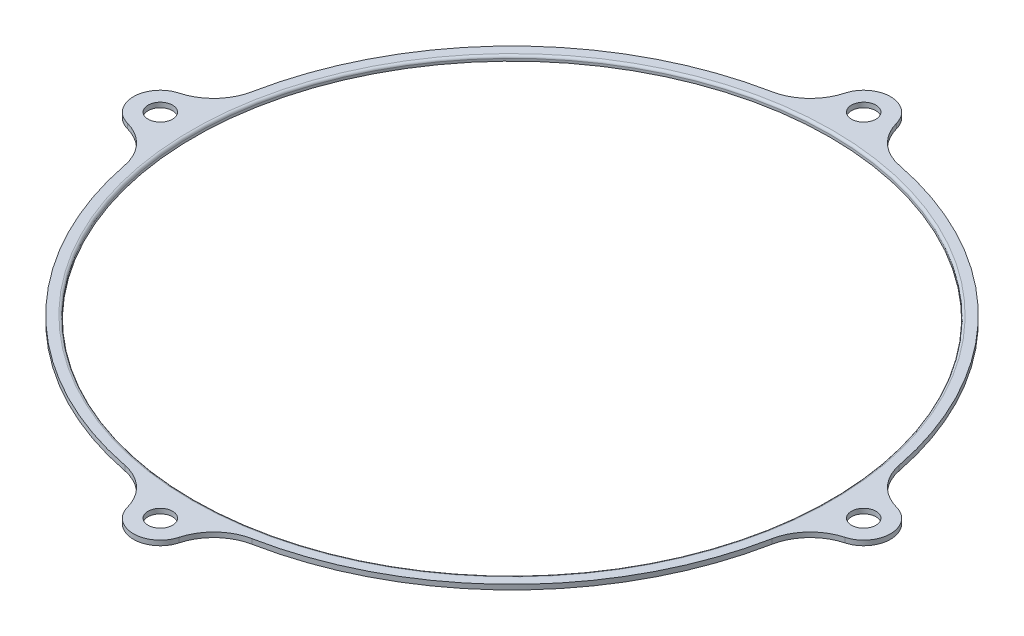
ISO-10303-21;
HEADER;
FILE_DESCRIPTION(('STEP AP214'),'2;1');
FILE_NAME('part.step','',(''),(''),'','','');
FILE_SCHEMA(('AUTOMOTIVE_DESIGN { 1 0 10303 214 1 1 1 1 }'));
ENDSEC;
DATA;
#1=APPLICATION_CONTEXT('core data for automotive mechanical design processes');
#2=APPLICATION_PROTOCOL_DEFINITION('international standard','automotive_design',2000,#1);
#3=PRODUCT_CONTEXT('',#1,'mechanical');
#4=PRODUCT('Part','Part','',(#3));
#5=PRODUCT_RELATED_PRODUCT_CATEGORY('part','',(#4));
#6=PRODUCT_DEFINITION_FORMATION('','',#4);
#7=PRODUCT_DEFINITION_CONTEXT('part definition',#1,'design');
#8=PRODUCT_DEFINITION('design','',#6,#7);
#9=PRODUCT_DEFINITION_SHAPE('','',#8);
#10=(LENGTH_UNIT() NAMED_UNIT(*) SI_UNIT(.MILLI.,.METRE.));
#11=(NAMED_UNIT(*) PLANE_ANGLE_UNIT() SI_UNIT($,.RADIAN.));
#12=(NAMED_UNIT(*) SI_UNIT($,.STERADIAN.) SOLID_ANGLE_UNIT());
#13=UNCERTAINTY_MEASURE_WITH_UNIT(LENGTH_MEASURE(1.E-05),#10,'distance_accuracy_value','');
#14=(GEOMETRIC_REPRESENTATION_CONTEXT(3) GLOBAL_UNCERTAINTY_ASSIGNED_CONTEXT((#13)) GLOBAL_UNIT_ASSIGNED_CONTEXT((#10,
#11,#12)) REPRESENTATION_CONTEXT('',''));
#15=CARTESIAN_POINT('',(0.,0.,0.));
#16=DIRECTION('',(0.,0.,1.));
#17=DIRECTION('',(1.,0.,0.));
#18=AXIS2_PLACEMENT_3D('',#15,#16,#17);
#19=CARTESIAN_POINT('',(0.,3.,0.));
#20=DIRECTION('',(0.,-1.,0.));
#21=DIRECTION('',(0.,0.,-1.));
#22=AXIS2_PLACEMENT_3D('',#19,#20,#21);
#23=CYLINDRICAL_SURFACE('',#22,67.5);
#24=DIRECTION('',(0.,-1.,0.));
#25=VECTOR('',#24,1.);
#26=CARTESIAN_POINT('',(-13.0329760411857,201.116127561589,66.2298387096774));
#27=LINE('',#26,#25);
#28=CARTESIAN_POINT('',(-13.0329760411857,1.,66.2298387096774));
#29=VERTEX_POINT('',#28);
#30=CARTESIAN_POINT('',(-13.0329760411857,0.,66.2298387096774));
#31=VERTEX_POINT('',#30);
#32=EDGE_CURVE('E274',#29,#31,#27,.T.);
#33=ORIENTED_EDGE('',*,*,#32,.F.);
#34=CARTESIAN_POINT('',(0.,1.,0.));
#35=DIRECTION('',(0.,-1.,0.));
#36=DIRECTION('',(0.,0.,-1.));
#37=AXIS2_PLACEMENT_3D('',#34,#35,#36);
#38=CIRCLE('',#37,67.5);
#39=CARTESIAN_POINT('',(-66.2298387096774,1.,13.0329760411855));
#40=VERTEX_POINT('',#39);
#41=EDGE_CURVE('E314',#29,#40,#38,.T.);
#42=ORIENTED_EDGE('',*,*,#41,.T.);
#43=DIRECTION('',(0.,-1.,0.));
#44=VECTOR('',#43,1.);
#45=CARTESIAN_POINT('',(-66.2298387096774,201.116127561589,13.0329760411855));
#46=LINE('',#45,#44);
#47=CARTESIAN_POINT('',(-66.2298387096774,0.,13.0329760411855));
#48=VERTEX_POINT('',#47);
#49=EDGE_CURVE('E272',#40,#48,#46,.T.);
#50=ORIENTED_EDGE('',*,*,#49,.T.);
#51=CARTESIAN_POINT('',(0.,0.,0.));
#52=DIRECTION('',(0.,1.,0.));
#53=DIRECTION('',(0.,0.,1.));
#54=AXIS2_PLACEMENT_3D('',#51,#52,#53);
#55=CIRCLE('',#54,67.5);
#56=EDGE_CURVE('E218',#48,#31,#55,.T.);
#57=ORIENTED_EDGE('',*,*,#56,.T.);
#58=EDGE_LOOP('',(#33,#42,#50,#57));
#59=FACE_BOUND('',#58,.T.);
#60=ADVANCED_FACE('F43',(#59),#23,.T.);
#61=DIRECTION('',(0.,-1.,0.));
#62=VECTOR('',#61,1.);
#63=CARTESIAN_POINT('',(13.0329760411862,201.116127561589,-66.2298387096773));
#64=LINE('',#63,#62);
#65=CARTESIAN_POINT('',(13.0329760411862,1.,-66.2298387096773));
#66=VERTEX_POINT('',#65);
#67=CARTESIAN_POINT('',(13.0329760411862,0.,-66.2298387096773));
#68=VERTEX_POINT('',#67);
#69=EDGE_CURVE('E174',#66,#68,#64,.T.);
#70=ORIENTED_EDGE('',*,*,#69,.F.);
#71=CARTESIAN_POINT('',(0.,1.,0.));
#72=DIRECTION('',(0.,-1.,0.));
#73=DIRECTION('',(0.,0.,-1.));
#74=AXIS2_PLACEMENT_3D('',#71,#72,#73);
#75=CIRCLE('',#74,67.5);
#76=CARTESIAN_POINT('',(66.2298387096774,1.,-13.0329760411855));
#77=VERTEX_POINT('',#76);
#78=EDGE_CURVE('E160',#66,#77,#75,.T.);
#79=ORIENTED_EDGE('',*,*,#78,.T.);
#80=DIRECTION('',(0.,-1.,0.));
#81=VECTOR('',#80,1.);
#82=CARTESIAN_POINT('',(66.2298387096774,201.116127561589,-13.0329760411855));
#83=LINE('',#82,#81);
#84=CARTESIAN_POINT('',(66.2298387096774,0.,-13.0329760411855));
#85=VERTEX_POINT('',#84);
#86=EDGE_CURVE('E172',#77,#85,#83,.T.);
#87=ORIENTED_EDGE('',*,*,#86,.T.);
#88=CARTESIAN_POINT('',(0.,0.,0.));
#89=DIRECTION('',(0.,1.,0.));
#90=DIRECTION('',(0.,0.,1.));
#91=AXIS2_PLACEMENT_3D('',#88,#89,#90);
#92=CIRCLE('',#91,67.5);
#93=EDGE_CURVE('E243',#85,#68,#92,.T.);
#94=ORIENTED_EDGE('',*,*,#93,.T.);
#95=EDGE_LOOP('',(#70,#79,#87,#94));
#96=FACE_BOUND('',#95,.T.);
#97=ADVANCED_FACE('F170',(#96),#23,.T.);
#98=DIRECTION('',(0.,-1.,0.));
#99=VECTOR('',#98,1.);
#100=CARTESIAN_POINT('',(-66.2298387096774,201.116127561589,-13.0329760411855));
#101=LINE('',#100,#99);
#102=CARTESIAN_POINT('',(-66.2298387096774,1.,-13.0329760411854));
#103=VERTEX_POINT('',#102);
#104=CARTESIAN_POINT('',(-66.2298387096774,0.,-13.0329760411855));
#105=VERTEX_POINT('',#104);
#106=EDGE_CURVE('E266',#103,#105,#101,.T.);
#107=ORIENTED_EDGE('',*,*,#106,.F.);
#108=CARTESIAN_POINT('',(0.,1.,0.));
#109=DIRECTION('',(0.,-1.,0.));
#110=DIRECTION('',(0.,0.,-1.));
#111=AXIS2_PLACEMENT_3D('',#108,#109,#110);
#112=CIRCLE('',#111,67.5);
#113=CARTESIAN_POINT('',(-13.0329760411848,1.,-66.2298387096776));
#114=VERTEX_POINT('',#113);
#115=EDGE_CURVE('E338',#103,#114,#112,.T.);
#116=ORIENTED_EDGE('',*,*,#115,.T.);
#117=DIRECTION('',(0.,-1.,0.));
#118=VECTOR('',#117,1.);
#119=CARTESIAN_POINT('',(-13.0329760411848,201.116127561589,-66.2298387096776));
#120=LINE('',#119,#118);
#121=CARTESIAN_POINT('',(-13.0329760411848,0.,-66.2298387096776));
#122=VERTEX_POINT('',#121);
#123=EDGE_CURVE('E264',#114,#122,#120,.T.);
#124=ORIENTED_EDGE('',*,*,#123,.T.);
#125=CARTESIAN_POINT('',(0.,0.,0.));
#126=DIRECTION('',(0.,1.,0.));
#127=DIRECTION('',(0.,0.,1.));
#128=AXIS2_PLACEMENT_3D('',#125,#126,#127);
#129=CIRCLE('',#128,67.5);
#130=EDGE_CURVE('E236',#122,#105,#129,.T.);
#131=ORIENTED_EDGE('',*,*,#130,.T.);
#132=EDGE_LOOP('',(#107,#116,#124,#131));
#133=FACE_BOUND('',#132,.T.);
#134=ADVANCED_FACE('F337',(#133),#23,.T.);
#135=DIRECTION('',(0.,-1.,0.));
#136=VECTOR('',#135,1.);
#137=CARTESIAN_POINT('',(66.2298387096774,201.116127561589,13.0329760411855));
#138=LINE('',#137,#136);
#139=CARTESIAN_POINT('',(66.2298387096774,1.,13.0329760411855));
#140=VERTEX_POINT('',#139);
#141=CARTESIAN_POINT('',(66.2298387096774,0.,13.0329760411855));
#142=VERTEX_POINT('',#141);
#143=EDGE_CURVE('E187',#140,#142,#138,.T.);
#144=ORIENTED_EDGE('',*,*,#143,.F.);
#145=CARTESIAN_POINT('',(0.,1.,0.));
#146=DIRECTION('',(0.,-1.,0.));
#147=DIRECTION('',(0.,0.,-1.));
#148=AXIS2_PLACEMENT_3D('',#145,#146,#147);
#149=CIRCLE('',#148,67.5);
#150=CARTESIAN_POINT('',(13.0329760411852,1.,66.2298387096775));
#151=VERTEX_POINT('',#150);
#152=EDGE_CURVE('E295',#140,#151,#149,.T.);
#153=ORIENTED_EDGE('',*,*,#152,.T.);
#154=DIRECTION('',(0.,-1.,0.));
#155=VECTOR('',#154,1.);
#156=CARTESIAN_POINT('',(13.0329760411852,201.116127561589,66.2298387096775));
#157=LINE('',#156,#155);
#158=CARTESIAN_POINT('',(13.0329760411852,0.,66.2298387096775));
#159=VERTEX_POINT('',#158);
#160=EDGE_CURVE('E66',#151,#159,#157,.T.);
#161=ORIENTED_EDGE('',*,*,#160,.T.);
#162=CARTESIAN_POINT('',(0.,0.,0.));
#163=DIRECTION('',(0.,1.,0.));
#164=DIRECTION('',(0.,0.,1.));
#165=AXIS2_PLACEMENT_3D('',#162,#163,#164);
#166=CIRCLE('',#165,67.5);
#167=EDGE_CURVE('E216',#159,#142,#166,.T.);
#168=ORIENTED_EDGE('',*,*,#167,.T.);
#169=EDGE_LOOP('',(#144,#153,#161,#168));
#170=FACE_BOUND('',#169,.T.);
#171=ADVANCED_FACE('F294',(#170),#23,.T.);
#172=CARTESIAN_POINT('',(76.0416666666667,201.116127561589,14.9637873065463));
#173=DIRECTION('',(0.,-1.,0.));
#174=DIRECTION('',(0.,0.,-1.));
#175=AXIS2_PLACEMENT_3D('',#172,#173,#174);
#176=CYLINDRICAL_SURFACE('',#175,10.);
#177=CARTESIAN_POINT('',(76.0416666666667,1.,14.9637873065463));
#178=DIRECTION('',(0.,1.,0.));
#179=DIRECTION('',(0.,0.,-1.));
#180=AXIS2_PLACEMENT_3D('',#177,#178,#179);
#181=CIRCLE('',#180,9.99999999999999);
#182=CARTESIAN_POINT('',(73.4341397849462,1.,5.30973097974224));
#183=VERTEX_POINT('',#182);
#184=EDGE_CURVE('E293',#183,#140,#181,.T.);
#185=ORIENTED_EDGE('',*,*,#184,.T.);
#186=ORIENTED_EDGE('',*,*,#143,.T.);
#187=CARTESIAN_POINT('',(76.0416666666667,0.,14.9637873065463));
#188=DIRECTION('',(0.,1.,0.));
#189=DIRECTION('',(0.,0.,1.));
#190=AXIS2_PLACEMENT_3D('',#187,#188,#189);
#191=CIRCLE('',#190,10.);
#192=CARTESIAN_POINT('',(73.4341397849462,0.,5.30973097974223));
#193=VERTEX_POINT('',#192);
#194=EDGE_CURVE('E227',#193,#142,#191,.T.);
#195=ORIENTED_EDGE('',*,*,#194,.F.);
#196=DIRECTION('',(0.,-1.,0.));
#197=VECTOR('',#196,1.);
#198=CARTESIAN_POINT('',(73.4341397849462,201.116127561589,5.30973097974223));
#199=LINE('',#198,#197);
#200=EDGE_CURVE('E183',#183,#193,#199,.T.);
#201=ORIENTED_EDGE('',*,*,#200,.F.);
#202=EDGE_LOOP('',(#185,#186,#195,#201));
#203=FACE_BOUND('',#202,.T.);
#204=ADVANCED_FACE('F291',(#203),#176,.F.);
#205=CARTESIAN_POINT('',(72.,201.116127561589,0.));
#206=DIRECTION('',(0.,-1.,0.));
#207=DIRECTION('',(0.,0.,-1.));
#208=AXIS2_PLACEMENT_3D('',#205,#206,#207);
#209=CYLINDRICAL_SURFACE('',#208,5.5);
#210=CARTESIAN_POINT('',(72.,1.,0.));
#211=DIRECTION('',(0.,-1.,0.));
#212=DIRECTION('',(0.,0.,-1.));
#213=AXIS2_PLACEMENT_3D('',#210,#211,#212);
#214=CIRCLE('',#213,5.5);
#215=CARTESIAN_POINT('',(73.4341397849462,1.,-5.30973097974223));
#216=VERTEX_POINT('',#215);
#217=EDGE_CURVE('E163',#216,#183,#214,.T.);
#218=ORIENTED_EDGE('',*,*,#217,.T.);
#219=ORIENTED_EDGE('',*,*,#200,.T.);
#220=CARTESIAN_POINT('',(72.,0.,0.));
#221=DIRECTION('',(0.,1.,0.));
#222=DIRECTION('',(0.,0.,1.));
#223=AXIS2_PLACEMENT_3D('',#220,#221,#222);
#224=CIRCLE('',#223,5.5);
#225=CARTESIAN_POINT('',(73.4341397849462,0.,-5.30973097974223));
#226=VERTEX_POINT('',#225);
#227=EDGE_CURVE('E233',#226,#193,#224,.F.);
#228=ORIENTED_EDGE('',*,*,#227,.F.);
#229=DIRECTION('',(0.,-1.,0.));
#230=VECTOR('',#229,1.);
#231=CARTESIAN_POINT('',(73.4341397849462,201.116127561589,-5.30973097974223));
#232=LINE('',#231,#230);
#233=EDGE_CURVE('E180',#216,#226,#232,.T.);
#234=ORIENTED_EDGE('',*,*,#233,.F.);
#235=EDGE_LOOP('',(#218,#219,#228,#234));
#236=FACE_BOUND('',#235,.T.);
#237=ADVANCED_FACE('F284',(#236),#209,.T.);
#238=CARTESIAN_POINT('',(76.0416666666667,201.116127561589,-14.9637873065463));
#239=DIRECTION('',(0.,-1.,0.));
#240=DIRECTION('',(0.,0.,-1.));
#241=AXIS2_PLACEMENT_3D('',#238,#239,#240);
#242=CYLINDRICAL_SURFACE('',#241,10.);
#243=CARTESIAN_POINT('',(76.0416666666667,1.,-14.9637873065463));
#244=DIRECTION('',(0.,1.,0.));
#245=DIRECTION('',(0.,0.,-1.));
#246=AXIS2_PLACEMENT_3D('',#243,#244,#245);
#247=CIRCLE('',#246,10.);
#248=EDGE_CURVE('E156',#77,#216,#247,.T.);
#249=ORIENTED_EDGE('',*,*,#248,.T.);
#250=ORIENTED_EDGE('',*,*,#233,.T.);
#251=CARTESIAN_POINT('',(76.0416666666667,0.,-14.9637873065463));
#252=DIRECTION('',(0.,1.,0.));
#253=DIRECTION('',(0.,0.,1.));
#254=AXIS2_PLACEMENT_3D('',#251,#252,#253);
#255=CIRCLE('',#254,10.);
#256=EDGE_CURVE('E179',#85,#226,#255,.T.);
#257=ORIENTED_EDGE('',*,*,#256,.F.);
#258=ORIENTED_EDGE('',*,*,#86,.F.);
#259=EDGE_LOOP('',(#249,#250,#257,#258));
#260=FACE_BOUND('',#259,.T.);
#261=ADVANCED_FACE('F177',(#260),#242,.F.);
#262=CARTESIAN_POINT('',(72.,201.116127561589,0.));
#263=DIRECTION('',(0.,-1.,0.));
#264=DIRECTION('',(0.,0.,-1.));
#265=AXIS2_PLACEMENT_3D('',#262,#263,#264);
#266=CYLINDRICAL_SURFACE('',#265,2.49999999999999);
#267=CARTESIAN_POINT('',(72.,1.,0.));
#268=DIRECTION('',(0.,-1.,0.));
#269=DIRECTION('',(0.,0.,-1.));
#270=AXIS2_PLACEMENT_3D('',#267,#268,#269);
#271=CIRCLE('',#270,2.49999999999999);
#272=CARTESIAN_POINT('',(72.,1.,-2.49999999999999));
#273=VERTEX_POINT('',#272);
#274=EDGE_CURVE('E195',#273,#273,#271,.F.);
#275=ORIENTED_EDGE('',*,*,#274,.T.);
#276=EDGE_LOOP('',(#275));
#277=FACE_BOUND('',#276,.T.);
#278=CARTESIAN_POINT('',(72.,0.,0.));
#279=DIRECTION('',(0.,1.,0.));
#280=DIRECTION('',(0.,0.,1.));
#281=AXIS2_PLACEMENT_3D('',#278,#279,#280);
#282=CIRCLE('',#281,2.49999999999999);
#283=CARTESIAN_POINT('',(72.,0.,2.49999999999999));
#284=VERTEX_POINT('',#283);
#285=EDGE_CURVE('E257',#284,#284,#282,.F.);
#286=ORIENTED_EDGE('',*,*,#285,.T.);
#287=EDGE_LOOP('',(#286));
#288=FACE_BOUND('',#287,.T.);
#289=ADVANCED_FACE('F416',(#277,#288),#266,.F.);
#290=CARTESIAN_POINT('',(-72.,201.116127561589,0.));
#291=DIRECTION('',(0.,-1.,0.));
#292=DIRECTION('',(0.,0.,-1.));
#293=AXIS2_PLACEMENT_3D('',#290,#291,#292);
#294=CYLINDRICAL_SURFACE('',#293,2.49999999999999);
#295=CARTESIAN_POINT('',(-72.,1.,0.));
#296=DIRECTION('',(0.,-1.,0.));
#297=DIRECTION('',(0.,0.,-1.));
#298=AXIS2_PLACEMENT_3D('',#295,#296,#297);
#299=CIRCLE('',#298,2.49999999999999);
#300=CARTESIAN_POINT('',(-72.,1.,-2.49999999999999));
#301=VERTEX_POINT('',#300);
#302=EDGE_CURVE('E199',#301,#301,#299,.F.);
#303=ORIENTED_EDGE('',*,*,#302,.T.);
#304=EDGE_LOOP('',(#303));
#305=FACE_BOUND('',#304,.T.);
#306=CARTESIAN_POINT('',(-72.,0.,0.));
#307=DIRECTION('',(0.,1.,0.));
#308=DIRECTION('',(0.,0.,1.));
#309=AXIS2_PLACEMENT_3D('',#306,#307,#308);
#310=CIRCLE('',#309,2.49999999999999);
#311=CARTESIAN_POINT('',(-72.,0.,2.49999999999999));
#312=VERTEX_POINT('',#311);
#313=EDGE_CURVE('E254',#312,#312,#310,.F.);
#314=ORIENTED_EDGE('',*,*,#313,.T.);
#315=EDGE_LOOP('',(#314));
#316=FACE_BOUND('',#315,.T.);
#317=ADVANCED_FACE('F410',(#305,#316),#294,.F.);
#318=CARTESIAN_POINT('',(-72.,201.116127561589,0.));
#319=DIRECTION('',(0.,-1.,0.));
#320=DIRECTION('',(0.,0.,-1.));
#321=AXIS2_PLACEMENT_3D('',#318,#319,#320);
#322=CYLINDRICAL_SURFACE('',#321,5.5);
#323=CARTESIAN_POINT('',(-72.,1.,0.));
#324=DIRECTION('',(0.,-1.,0.));
#325=DIRECTION('',(0.,0.,-1.));
#326=AXIS2_PLACEMENT_3D('',#323,#324,#325);
#327=CIRCLE('',#326,5.5);
#328=CARTESIAN_POINT('',(-73.4341397849462,1.,5.30973097974223));
#329=VERTEX_POINT('',#328);
#330=CARTESIAN_POINT('',(-73.4341397849462,1.,-5.30973097974223));
#331=VERTEX_POINT('',#330);
#332=EDGE_CURVE('E326',#329,#331,#327,.T.);
#333=ORIENTED_EDGE('',*,*,#332,.T.);
#334=DIRECTION('',(0.,-1.,0.));
#335=VECTOR('',#334,1.);
#336=CARTESIAN_POINT('',(-73.4341397849462,201.116127561589,-5.30973097974223));
#337=LINE('',#336,#335);
#338=CARTESIAN_POINT('',(-73.4341397849462,0.,-5.30973097974223));
#339=VERTEX_POINT('',#338);
#340=EDGE_CURVE('E268',#331,#339,#337,.T.);
#341=ORIENTED_EDGE('',*,*,#340,.T.);
#342=CARTESIAN_POINT('',(-72.,0.,0.));
#343=DIRECTION('',(0.,1.,0.));
#344=DIRECTION('',(0.,0.,1.));
#345=AXIS2_PLACEMENT_3D('',#342,#343,#344);
#346=CIRCLE('',#345,5.5);
#347=CARTESIAN_POINT('',(-73.4341397849462,0.,5.30973097974223));
#348=VERTEX_POINT('',#347);
#349=EDGE_CURVE('E224',#348,#339,#346,.F.);
#350=ORIENTED_EDGE('',*,*,#349,.F.);
#351=DIRECTION('',(0.,-1.,0.));
#352=VECTOR('',#351,1.);
#353=CARTESIAN_POINT('',(-73.4341397849462,201.116127561589,5.30973097974223));
#354=LINE('',#353,#352);
#355=EDGE_CURVE('E270',#329,#348,#354,.T.);
#356=ORIENTED_EDGE('',*,*,#355,.F.);
#357=EDGE_LOOP('',(#333,#341,#350,#356));
#358=FACE_BOUND('',#357,.T.);
#359=ADVANCED_FACE('F325',(#358),#322,.T.);
#360=CARTESIAN_POINT('',(-76.0416666666667,201.116127561589,14.9637873065463));
#361=DIRECTION('',(0.,-1.,0.));
#362=DIRECTION('',(0.,0.,-1.));
#363=AXIS2_PLACEMENT_3D('',#360,#361,#362);
#364=CYLINDRICAL_SURFACE('',#363,10.);
#365=CARTESIAN_POINT('',(-76.0416666666667,1.,14.9637873065463));
#366=DIRECTION('',(0.,1.,0.));
#367=DIRECTION('',(0.,0.,-1.));
#368=AXIS2_PLACEMENT_3D('',#365,#366,#367);
#369=CIRCLE('',#368,9.99999999999999);
#370=EDGE_CURVE('E322',#40,#329,#369,.T.);
#371=ORIENTED_EDGE('',*,*,#370,.T.);
#372=ORIENTED_EDGE('',*,*,#355,.T.);
#373=CARTESIAN_POINT('',(-76.0416666666667,0.,14.9637873065463));
#374=DIRECTION('',(0.,1.,0.));
#375=DIRECTION('',(0.,0.,1.));
#376=AXIS2_PLACEMENT_3D('',#373,#374,#375);
#377=CIRCLE('',#376,10.);
#378=EDGE_CURVE('E221',#48,#348,#377,.T.);
#379=ORIENTED_EDGE('',*,*,#378,.F.);
#380=ORIENTED_EDGE('',*,*,#49,.F.);
#381=EDGE_LOOP('',(#371,#372,#379,#380));
#382=FACE_BOUND('',#381,.T.);
#383=ADVANCED_FACE('F320',(#382),#364,.F.);
#384=CARTESIAN_POINT('',(-76.0416666666667,201.116127561589,-14.9637873065463));
#385=DIRECTION('',(0.,-1.,0.));
#386=DIRECTION('',(0.,0.,-1.));
#387=AXIS2_PLACEMENT_3D('',#384,#385,#386);
#388=CYLINDRICAL_SURFACE('',#387,10.);
#389=CARTESIAN_POINT('',(-76.0416666666667,1.,-14.9637873065463));
#390=DIRECTION('',(0.,1.,0.));
#391=DIRECTION('',(0.,0.,-1.));
#392=AXIS2_PLACEMENT_3D('',#389,#390,#391);
#393=CIRCLE('',#392,9.99999999999999);
#394=EDGE_CURVE('E334',#331,#103,#393,.T.);
#395=ORIENTED_EDGE('',*,*,#394,.T.);
#396=ORIENTED_EDGE('',*,*,#106,.T.);
#397=CARTESIAN_POINT('',(-76.0416666666667,0.,-14.9637873065463));
#398=DIRECTION('',(0.,1.,0.));
#399=DIRECTION('',(0.,0.,1.));
#400=AXIS2_PLACEMENT_3D('',#397,#398,#399);
#401=CIRCLE('',#400,10.);
#402=EDGE_CURVE('E230',#339,#105,#401,.T.);
#403=ORIENTED_EDGE('',*,*,#402,.F.);
#404=ORIENTED_EDGE('',*,*,#340,.F.);
#405=EDGE_LOOP('',(#395,#396,#403,#404));
#406=FACE_BOUND('',#405,.T.);
#407=ADVANCED_FACE('F332',(#406),#388,.F.);
#408=CARTESIAN_POINT('',(-14.9637873065455,201.116127561589,-76.0416666666668));
#409=DIRECTION('',(0.,-1.,0.));
#410=DIRECTION('',(0.,0.,-1.));
#411=AXIS2_PLACEMENT_3D('',#408,#409,#410);
#412=CYLINDRICAL_SURFACE('',#411,10.);
#413=CARTESIAN_POINT('',(-14.9637873065455,1.,-76.0416666666668));
#414=DIRECTION('',(0.,1.,0.));
#415=DIRECTION('',(0.,0.,-1.));
#416=AXIS2_PLACEMENT_3D('',#413,#414,#415);
#417=CIRCLE('',#416,10.);
#418=CARTESIAN_POINT('',(-5.30973097974146,1.,-73.4341397849463));
#419=VERTEX_POINT('',#418);
#420=EDGE_CURVE('E346',#114,#419,#417,.T.);
#421=ORIENTED_EDGE('',*,*,#420,.T.);
#422=DIRECTION('',(0.,-1.,0.));
#423=VECTOR('',#422,1.);
#424=CARTESIAN_POINT('',(-5.30973097974146,201.116127561589,-73.4341397849463));
#425=LINE('',#424,#423);
#426=CARTESIAN_POINT('',(-5.30973097974146,0.,-73.4341397849463));
#427=VERTEX_POINT('',#426);
#428=EDGE_CURVE('E262',#419,#427,#425,.T.);
#429=ORIENTED_EDGE('',*,*,#428,.T.);
#430=CARTESIAN_POINT('',(-14.9637873065455,0.,-76.0416666666668));
#431=DIRECTION('',(0.,1.,0.));
#432=DIRECTION('',(0.,0.,1.));
#433=AXIS2_PLACEMENT_3D('',#430,#431,#432);
#434=CIRCLE('',#433,10.);
#435=EDGE_CURVE('E239',#122,#427,#434,.T.);
#436=ORIENTED_EDGE('',*,*,#435,.F.);
#437=ORIENTED_EDGE('',*,*,#123,.F.);
#438=EDGE_LOOP('',(#421,#429,#436,#437));
#439=FACE_BOUND('',#438,.T.);
#440=ADVANCED_FACE('F344',(#439),#412,.F.);
#441=CARTESIAN_POINT('',(14.9637873065471,201.116127561589,-76.0416666666665));
#442=DIRECTION('',(0.,-1.,0.));
#443=DIRECTION('',(0.,0.,-1.));
#444=AXIS2_PLACEMENT_3D('',#441,#442,#443);
#445=CYLINDRICAL_SURFACE('',#444,10.);
#446=CARTESIAN_POINT('',(14.9637873065471,1.,-76.0416666666665));
#447=DIRECTION('',(0.,1.,0.));
#448=DIRECTION('',(0.,0.,-1.));
#449=AXIS2_PLACEMENT_3D('',#446,#447,#448);
#450=CIRCLE('',#449,10.);
#451=CARTESIAN_POINT('',(5.309730979743,1.,-73.4341397849462));
#452=VERTEX_POINT('',#451);
#453=EDGE_CURVE('E355',#452,#66,#450,.T.);
#454=ORIENTED_EDGE('',*,*,#453,.T.);
#455=ORIENTED_EDGE('',*,*,#69,.T.);
#456=CARTESIAN_POINT('',(14.9637873065471,0.,-76.0416666666665));
#457=DIRECTION('',(0.,1.,0.));
#458=DIRECTION('',(0.,0.,1.));
#459=AXIS2_PLACEMENT_3D('',#456,#457,#458);
#460=CIRCLE('',#459,10.);
#461=CARTESIAN_POINT('',(5.309730979743,0.,-73.4341397849462));
#462=VERTEX_POINT('',#461);
#463=EDGE_CURVE('E248',#462,#68,#460,.T.);
#464=ORIENTED_EDGE('',*,*,#463,.F.);
#465=DIRECTION('',(0.,-1.,0.));
#466=VECTOR('',#465,1.);
#467=CARTESIAN_POINT('',(5.309730979743,201.116127561589,-73.4341397849462));
#468=LINE('',#467,#466);
#469=EDGE_CURVE('E260',#452,#462,#468,.T.);
#470=ORIENTED_EDGE('',*,*,#469,.F.);
#471=EDGE_LOOP('',(#454,#455,#464,#470));
#472=FACE_BOUND('',#471,.T.);
#473=ADVANCED_FACE('F354',(#472),#445,.F.);
#474=CARTESIAN_POINT('',(7.54159969190117E-13,201.116127561589,-72.));
#475=DIRECTION('',(0.,-1.,0.));
#476=DIRECTION('',(0.,0.,-1.));
#477=AXIS2_PLACEMENT_3D('',#474,#475,#476);
#478=CYLINDRICAL_SURFACE('',#477,5.5);
#479=CARTESIAN_POINT('',(7.54159969190117E-13,1.,-72.));
#480=DIRECTION('',(0.,-1.,0.));
#481=DIRECTION('',(0.,0.,-1.));
#482=AXIS2_PLACEMENT_3D('',#479,#480,#481);
#483=CIRCLE('',#482,5.5);
#484=EDGE_CURVE('E350',#419,#452,#483,.T.);
#485=ORIENTED_EDGE('',*,*,#484,.T.);
#486=ORIENTED_EDGE('',*,*,#469,.T.);
#487=CARTESIAN_POINT('',(7.54159969190117E-13,0.,-72.));
#488=DIRECTION('',(0.,1.,0.));
#489=DIRECTION('',(0.,0.,1.));
#490=AXIS2_PLACEMENT_3D('',#487,#488,#489);
#491=CIRCLE('',#490,5.5);
#492=EDGE_CURVE('E245',#427,#462,#491,.F.);
#493=ORIENTED_EDGE('',*,*,#492,.F.);
#494=ORIENTED_EDGE('',*,*,#428,.F.);
#495=EDGE_LOOP('',(#485,#486,#493,#494));
#496=FACE_BOUND('',#495,.T.);
#497=ADVANCED_FACE('F349',(#496),#478,.T.);
#498=CARTESIAN_POINT('',(7.54159969190117E-13,201.116127561589,-72.));
#499=DIRECTION('',(0.,-1.,0.));
#500=DIRECTION('',(0.,0.,-1.));
#501=AXIS2_PLACEMENT_3D('',#498,#499,#500);
#502=CYLINDRICAL_SURFACE('',#501,2.49999999999999);
#503=CARTESIAN_POINT('',(7.54159969190117E-13,1.,-72.));
#504=DIRECTION('',(0.,-1.,0.));
#505=DIRECTION('',(0.,0.,-1.));
#506=AXIS2_PLACEMENT_3D('',#503,#504,#505);
#507=CIRCLE('',#506,2.49999999999999);
#508=CARTESIAN_POINT('',(7.54159969190117E-13,1.,-74.5));
#509=VERTEX_POINT('',#508);
#510=EDGE_CURVE('E204',#509,#509,#507,.F.);
#511=ORIENTED_EDGE('',*,*,#510,.T.);
#512=EDGE_LOOP('',(#511));
#513=FACE_BOUND('',#512,.T.);
#514=CARTESIAN_POINT('',(7.54159969190117E-13,0.,-72.));
#515=DIRECTION('',(0.,1.,0.));
#516=DIRECTION('',(0.,0.,1.));
#517=AXIS2_PLACEMENT_3D('',#514,#515,#516);
#518=CIRCLE('',#517,2.49999999999999);
#519=CARTESIAN_POINT('',(7.54159969190117E-13,0.,-69.5));
#520=VERTEX_POINT('',#519);
#521=EDGE_CURVE('E251',#520,#520,#518,.F.);
#522=ORIENTED_EDGE('',*,*,#521,.T.);
#523=EDGE_LOOP('',(#522));
#524=FACE_BOUND('',#523,.T.);
#525=ADVANCED_FACE('F365',(#513,#524),#502,.F.);
#526=CARTESIAN_POINT('',(-14.9637873065465,201.116127561589,76.0416666666666));
#527=DIRECTION('',(0.,-1.,0.));
#528=DIRECTION('',(0.,0.,-1.));
#529=AXIS2_PLACEMENT_3D('',#526,#527,#528);
#530=CYLINDRICAL_SURFACE('',#529,10.);
#531=CARTESIAN_POINT('',(-14.9637873065465,1.,76.0416666666666));
#532=DIRECTION('',(0.,1.,0.));
#533=DIRECTION('',(0.,0.,-1.));
#534=AXIS2_PLACEMENT_3D('',#531,#532,#533);
#535=CIRCLE('',#534,9.99999999999999);
#536=CARTESIAN_POINT('',(-5.30973097974249,1.,73.4341397849462));
#537=VERTEX_POINT('',#536);
#538=EDGE_CURVE('E311',#537,#29,#535,.T.);
#539=ORIENTED_EDGE('',*,*,#538,.T.);
#540=ORIENTED_EDGE('',*,*,#32,.T.);
#541=CARTESIAN_POINT('',(-14.9637873065465,0.,76.0416666666666));
#542=DIRECTION('',(0.,1.,0.));
#543=DIRECTION('',(0.,0.,1.));
#544=AXIS2_PLACEMENT_3D('',#541,#542,#543);
#545=CIRCLE('',#544,10.);
#546=CARTESIAN_POINT('',(-5.30973097974248,0.,73.4341397849462));
#547=VERTEX_POINT('',#546);
#548=EDGE_CURVE('E213',#547,#31,#545,.T.);
#549=ORIENTED_EDGE('',*,*,#548,.F.);
#550=DIRECTION('',(0.,-1.,0.));
#551=VECTOR('',#550,1.);
#552=CARTESIAN_POINT('',(-5.30973097974248,201.116127561589,73.4341397849462));
#553=LINE('',#552,#551);
#554=EDGE_CURVE('E276',#537,#547,#553,.T.);
#555=ORIENTED_EDGE('',*,*,#554,.F.);
#556=EDGE_LOOP('',(#539,#540,#549,#555));
#557=FACE_BOUND('',#556,.T.);
#558=ADVANCED_FACE('F309',(#557),#530,.F.);
#559=CARTESIAN_POINT('',(-2.51386656396706E-13,201.116127561589,72.));
#560=DIRECTION('',(0.,-1.,0.));
#561=DIRECTION('',(0.,0.,-1.));
#562=AXIS2_PLACEMENT_3D('',#559,#560,#561);
#563=CYLINDRICAL_SURFACE('',#562,5.5);
#564=CARTESIAN_POINT('',(-2.51386656396706E-13,1.,72.));
#565=DIRECTION('',(0.,-1.,0.));
#566=DIRECTION('',(0.,0.,-1.));
#567=AXIS2_PLACEMENT_3D('',#564,#565,#566);
#568=CIRCLE('',#567,5.5);
#569=CARTESIAN_POINT('',(5.30973097974197,1.,73.4341397849462));
#570=VERTEX_POINT('',#569);
#571=EDGE_CURVE('E58',#570,#537,#568,.T.);
#572=ORIENTED_EDGE('',*,*,#571,.T.);
#573=ORIENTED_EDGE('',*,*,#554,.T.);
#574=CARTESIAN_POINT('',(-2.51386656396706E-13,0.,72.));
#575=DIRECTION('',(0.,1.,0.));
#576=DIRECTION('',(0.,0.,1.));
#577=AXIS2_PLACEMENT_3D('',#574,#575,#576);
#578=CIRCLE('',#577,5.5);
#579=CARTESIAN_POINT('',(5.30973097974197,0.,73.4341397849462));
#580=VERTEX_POINT('',#579);
#581=EDGE_CURVE('E210',#580,#547,#578,.F.);
#582=ORIENTED_EDGE('',*,*,#581,.F.);
#583=DIRECTION('',(0.,-1.,0.));
#584=VECTOR('',#583,1.);
#585=CARTESIAN_POINT('',(5.30973097974197,201.116127561589,73.4341397849462));
#586=LINE('',#585,#584);
#587=EDGE_CURVE('E278',#570,#580,#586,.T.);
#588=ORIENTED_EDGE('',*,*,#587,.F.);
#589=EDGE_LOOP('',(#572,#573,#582,#588));
#590=FACE_BOUND('',#589,.T.);
#591=ADVANCED_FACE('F303',(#590),#563,.T.);
#592=CARTESIAN_POINT('',(14.963787306546,201.116127561589,76.0416666666667));
#593=DIRECTION('',(0.,-1.,0.));
#594=DIRECTION('',(0.,0.,-1.));
#595=AXIS2_PLACEMENT_3D('',#592,#593,#594);
#596=CYLINDRICAL_SURFACE('',#595,10.);
#597=CARTESIAN_POINT('',(14.963787306546,1.,76.0416666666667));
#598=DIRECTION('',(0.,1.,0.));
#599=DIRECTION('',(0.,0.,-1.));
#600=AXIS2_PLACEMENT_3D('',#597,#598,#599);
#601=CIRCLE('',#600,10.);
#602=EDGE_CURVE('E301',#151,#570,#601,.T.);
#603=ORIENTED_EDGE('',*,*,#602,.T.);
#604=ORIENTED_EDGE('',*,*,#587,.T.);
#605=CARTESIAN_POINT('',(14.963787306546,0.,76.0416666666667));
#606=DIRECTION('',(0.,1.,0.));
#607=DIRECTION('',(0.,0.,1.));
#608=AXIS2_PLACEMENT_3D('',#605,#606,#607);
#609=CIRCLE('',#608,10.);
#610=EDGE_CURVE('E192',#159,#580,#609,.T.);
#611=ORIENTED_EDGE('',*,*,#610,.F.);
#612=ORIENTED_EDGE('',*,*,#160,.F.);
#613=EDGE_LOOP('',(#603,#604,#611,#612));
#614=FACE_BOUND('',#613,.T.);
#615=ADVANCED_FACE('F299',(#614),#596,.F.);
#616=CARTESIAN_POINT('',(-2.51386656396706E-13,201.116127561589,72.));
#617=DIRECTION('',(0.,-1.,0.));
#618=DIRECTION('',(0.,0.,-1.));
#619=AXIS2_PLACEMENT_3D('',#616,#617,#618);
#620=CYLINDRICAL_SURFACE('',#619,2.49999999999999);
#621=CARTESIAN_POINT('',(-2.51386656396706E-13,1.,72.));
#622=DIRECTION('',(0.,-1.,0.));
#623=DIRECTION('',(0.,0.,-1.));
#624=AXIS2_PLACEMENT_3D('',#621,#622,#623);
#625=CIRCLE('',#624,2.49999999999999);
#626=CARTESIAN_POINT('',(-2.51386656396706E-13,1.,69.5));
#627=VERTEX_POINT('',#626);
#628=EDGE_CURVE('E356',#627,#627,#625,.F.);
#629=ORIENTED_EDGE('',*,*,#628,.T.);
#630=EDGE_LOOP('',(#629));
#631=FACE_BOUND('',#630,.T.);
#632=CARTESIAN_POINT('',(-2.51386656396706E-13,0.,72.));
#633=DIRECTION('',(0.,1.,0.));
#634=DIRECTION('',(0.,0.,1.));
#635=AXIS2_PLACEMENT_3D('',#632,#633,#634);
#636=CIRCLE('',#635,2.49999999999999);
#637=CARTESIAN_POINT('',(-2.51386656396706E-13,0.,74.5));
#638=VERTEX_POINT('',#637);
#639=EDGE_CURVE('E189',#638,#638,#636,.F.);
#640=ORIENTED_EDGE('',*,*,#639,.T.);
#641=EDGE_LOOP('',(#640));
#642=FACE_BOUND('',#641,.T.);
#643=ADVANCED_FACE('F489',(#631,#642),#620,.F.);
#644=CARTESIAN_POINT('',(0.,0.,0.));
#645=DIRECTION('',(0.,1.,0.));
#646=DIRECTION('',(0.,0.,1.));
#647=AXIS2_PLACEMENT_3D('',#644,#645,#646);
#648=PLANE('',#647);
#649=CARTESIAN_POINT('',(0.,0.,0.));
#650=DIRECTION('',(0.,1.,0.));
#651=DIRECTION('',(0.,0.,1.));
#652=AXIS2_PLACEMENT_3D('',#649,#650,#651);
#653=CIRCLE('',#652,65.1);
#654=CARTESIAN_POINT('',(0.,0.,65.1));
#655=VERTEX_POINT('',#654);
#656=EDGE_CURVE('E193',#655,#655,#653,.T.);
#657=ORIENTED_EDGE('',*,*,#656,.T.);
#658=EDGE_LOOP('',(#657));
#659=FACE_BOUND('',#658,.T.);
#660=ORIENTED_EDGE('',*,*,#313,.F.);
#661=EDGE_LOOP('',(#660));
#662=FACE_BOUND('',#661,.T.);
#663=ORIENTED_EDGE('',*,*,#639,.F.);
#664=EDGE_LOOP('',(#663));
#665=FACE_BOUND('',#664,.T.);
#666=ORIENTED_EDGE('',*,*,#463,.T.);
#667=ORIENTED_EDGE('',*,*,#93,.F.);
#668=ORIENTED_EDGE('',*,*,#256,.T.);
#669=ORIENTED_EDGE('',*,*,#227,.T.);
#670=ORIENTED_EDGE('',*,*,#194,.T.);
#671=ORIENTED_EDGE('',*,*,#167,.F.);
#672=ORIENTED_EDGE('',*,*,#610,.T.);
#673=ORIENTED_EDGE('',*,*,#581,.T.);
#674=ORIENTED_EDGE('',*,*,#548,.T.);
#675=ORIENTED_EDGE('',*,*,#56,.F.);
#676=ORIENTED_EDGE('',*,*,#378,.T.);
#677=ORIENTED_EDGE('',*,*,#349,.T.);
#678=ORIENTED_EDGE('',*,*,#402,.T.);
#679=ORIENTED_EDGE('',*,*,#130,.F.);
#680=ORIENTED_EDGE('',*,*,#435,.T.);
#681=ORIENTED_EDGE('',*,*,#492,.T.);
#682=EDGE_LOOP('',(#666,#667,#668,#669,#670,#671,#672,#673,#674,#675,#676,#677,#678,#679,#680,#681));
#683=FACE_BOUND('',#682,.T.);
#684=ORIENTED_EDGE('',*,*,#521,.F.);
#685=EDGE_LOOP('',(#684));
#686=FACE_BOUND('',#685,.T.);
#687=ORIENTED_EDGE('',*,*,#285,.F.);
#688=EDGE_LOOP('',(#687));
#689=FACE_BOUND('',#688,.T.);
#690=ADVANCED_FACE('F289',(#659,#662,#665,#683,#686,#689),#648,.F.);
#691=CARTESIAN_POINT('',(0.,0.,0.));
#692=DIRECTION('',(0.,1.,0.));
#693=DIRECTION('',(0.,0.,1.));
#694=AXIS2_PLACEMENT_3D('',#691,#692,#693);
#695=CYLINDRICAL_SURFACE('',#694,65.1);
#696=CARTESIAN_POINT('',(0.,0.5,0.));
#697=DIRECTION('',(0.,-1.,0.));
#698=DIRECTION('',(0.,0.,-1.));
#699=AXIS2_PLACEMENT_3D('',#696,#697,#698);
#700=CIRCLE('',#699,65.1);
#701=CARTESIAN_POINT('',(0.,0.5,-65.1));
#702=VERTEX_POINT('',#701);
#703=EDGE_CURVE('E51',#702,#702,#700,.F.);
#704=ORIENTED_EDGE('',*,*,#703,.T.);
#705=EDGE_LOOP('',(#704));
#706=FACE_BOUND('',#705,.T.);
#707=ORIENTED_EDGE('',*,*,#656,.F.);
#708=EDGE_LOOP('',(#707));
#709=FACE_BOUND('',#708,.T.);
#710=ADVANCED_FACE('F369',(#706,#709),#695,.F.);
#711=CARTESIAN_POINT('',(38.0208333333333,1.,-7.48189365327314));
#712=DIRECTION('',(0.,-1.,0.));
#713=DIRECTION('',(0.,0.,-1.));
#714=AXIS2_PLACEMENT_3D('',#711,#712,#713);
#715=PLANE('',#714);
#716=CARTESIAN_POINT('',(0.,1.,0.));
#717=DIRECTION('',(0.,-1.,0.));
#718=DIRECTION('',(0.,0.,-1.));
#719=AXIS2_PLACEMENT_3D('',#716,#717,#718);
#720=CIRCLE('',#719,65.6);
#721=CARTESIAN_POINT('',(0.,1.,-65.6));
#722=VERTEX_POINT('',#721);
#723=EDGE_CURVE('E12',#722,#722,#720,.T.);
#724=ORIENTED_EDGE('',*,*,#723,.T.);
#725=EDGE_LOOP('',(#724));
#726=FACE_BOUND('',#725,.T.);
#727=ORIENTED_EDGE('',*,*,#302,.F.);
#728=EDGE_LOOP('',(#727));
#729=FACE_BOUND('',#728,.T.);
#730=ORIENTED_EDGE('',*,*,#628,.F.);
#731=EDGE_LOOP('',(#730));
#732=FACE_BOUND('',#731,.T.);
#733=ORIENTED_EDGE('',*,*,#78,.F.);
#734=ORIENTED_EDGE('',*,*,#453,.F.);
#735=ORIENTED_EDGE('',*,*,#484,.F.);
#736=ORIENTED_EDGE('',*,*,#420,.F.);
#737=ORIENTED_EDGE('',*,*,#115,.F.);
#738=ORIENTED_EDGE('',*,*,#394,.F.);
#739=ORIENTED_EDGE('',*,*,#332,.F.);
#740=ORIENTED_EDGE('',*,*,#370,.F.);
#741=ORIENTED_EDGE('',*,*,#41,.F.);
#742=ORIENTED_EDGE('',*,*,#538,.F.);
#743=ORIENTED_EDGE('',*,*,#571,.F.);
#744=ORIENTED_EDGE('',*,*,#602,.F.);
#745=ORIENTED_EDGE('',*,*,#152,.F.);
#746=ORIENTED_EDGE('',*,*,#184,.F.);
#747=ORIENTED_EDGE('',*,*,#217,.F.);
#748=ORIENTED_EDGE('',*,*,#248,.F.);
#749=EDGE_LOOP('',(#733,#734,#735,#736,#737,#738,#739,#740,#741,#742,#743,#744,#745,#746,#747,#748));
#750=FACE_BOUND('',#749,.T.);
#751=ORIENTED_EDGE('',*,*,#510,.F.);
#752=EDGE_LOOP('',(#751));
#753=FACE_BOUND('',#752,.T.);
#754=ORIENTED_EDGE('',*,*,#274,.F.);
#755=EDGE_LOOP('',(#754));
#756=FACE_BOUND('',#755,.T.);
#757=ADVANCED_FACE('F158',(#726,#729,#732,#750,#753,#756),#715,.F.);
#758=CARTESIAN_POINT('',(0.,0.5,0.));
#759=DIRECTION('',(0.,-1.,0.));
#760=DIRECTION('',(0.,0.,-1.));
#761=AXIS2_PLACEMENT_3D('',#758,#759,#760);
#762=TOROIDAL_SURFACE('',#761,65.6,0.5);
#763=ORIENTED_EDGE('',*,*,#723,.F.);
#764=EDGE_LOOP('',(#763));
#765=FACE_BOUND('',#764,.T.);
#766=ORIENTED_EDGE('',*,*,#703,.F.);
#767=EDGE_LOOP('',(#766));
#768=FACE_BOUND('',#767,.T.);
#769=ADVANCED_FACE('F45',(#765,#768),#762,.T.);
#770=CLOSED_SHELL('',(#60,#97,#134,#171,#204,#237,#261,#289,#317,#359,#383,#407,#440,#473,#497,
#525,#558,#591,#615,#643,#690,#710,#757,#769));
#771=MANIFOLD_SOLID_BREP('B2',#770);
#772=ADVANCED_BREP_SHAPE_REPRESENTATION('',(#18,#771),#14);
#773=SHAPE_DEFINITION_REPRESENTATION(#9,#772);
ENDSEC;
END-ISO-10303-21;
